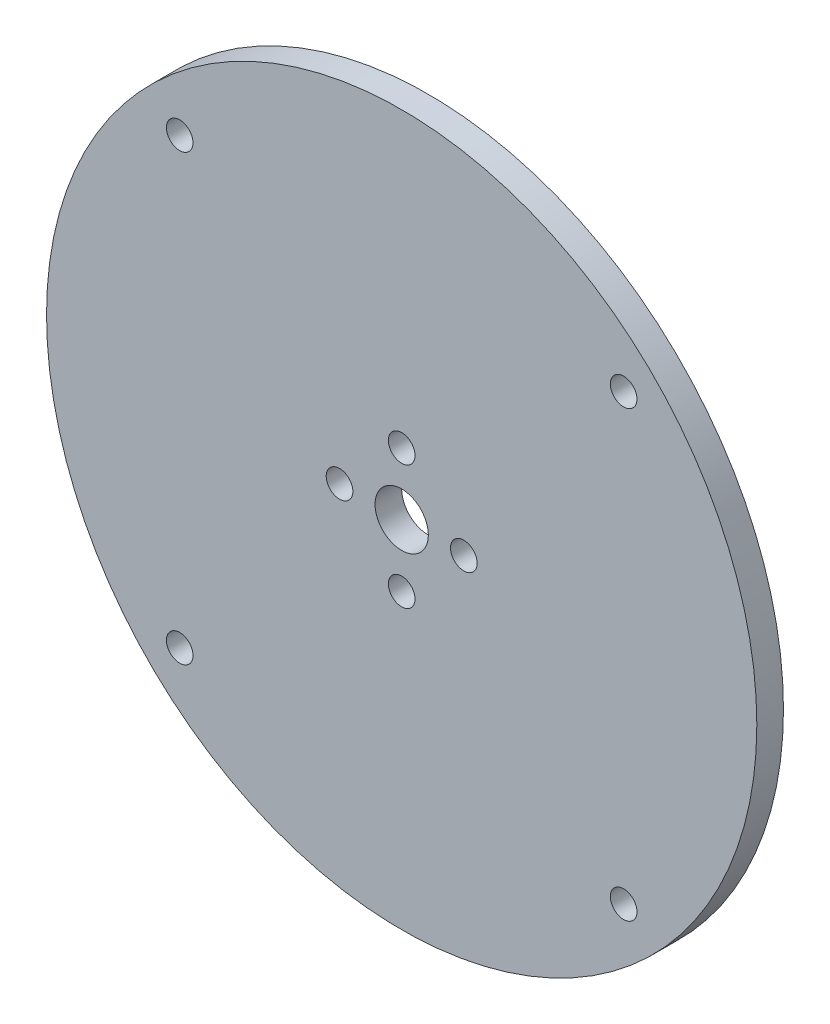
ISO-10303-21;
HEADER;
FILE_DESCRIPTION(('STEP AP214'),'2;1');
FILE_NAME('part.step','',(''),(''),'','','');
FILE_SCHEMA(('AUTOMOTIVE_DESIGN { 1 0 10303 214 1 1 1 1 }'));
ENDSEC;
DATA;
#1=APPLICATION_CONTEXT('core data for automotive mechanical design processes');
#2=APPLICATION_PROTOCOL_DEFINITION('international standard','automotive_design',2000,#1);
#3=PRODUCT_CONTEXT('',#1,'mechanical');
#4=PRODUCT('Part','Part','',(#3));
#5=PRODUCT_RELATED_PRODUCT_CATEGORY('part','',(#4));
#6=PRODUCT_DEFINITION_FORMATION('','',#4);
#7=PRODUCT_DEFINITION_CONTEXT('part definition',#1,'design');
#8=PRODUCT_DEFINITION('design','',#6,#7);
#9=PRODUCT_DEFINITION_SHAPE('','',#8);
#10=(LENGTH_UNIT() NAMED_UNIT(*) SI_UNIT(.MILLI.,.METRE.));
#11=(NAMED_UNIT(*) PLANE_ANGLE_UNIT() SI_UNIT($,.RADIAN.));
#12=(NAMED_UNIT(*) SI_UNIT($,.STERADIAN.) SOLID_ANGLE_UNIT());
#13=UNCERTAINTY_MEASURE_WITH_UNIT(LENGTH_MEASURE(1.E-05),#10,'distance_accuracy_value','');
#14=(GEOMETRIC_REPRESENTATION_CONTEXT(3) GLOBAL_UNCERTAINTY_ASSIGNED_CONTEXT((#13)) GLOBAL_UNIT_ASSIGNED_CONTEXT((#10,
#11,#12)) REPRESENTATION_CONTEXT('',''));
#15=CARTESIAN_POINT('',(0.,0.,0.));
#16=DIRECTION('',(0.,0.,1.));
#17=DIRECTION('',(1.,0.,0.));
#18=AXIS2_PLACEMENT_3D('',#15,#16,#17);
#19=CARTESIAN_POINT('',(7.,0.,3.));
#20=DIRECTION('',(0.,0.,-1.));
#21=DIRECTION('',(-1.,0.,0.));
#22=AXIS2_PLACEMENT_3D('',#19,#20,#21);
#23=CYLINDRICAL_SURFACE('',#22,1.5);
#24=CARTESIAN_POINT('',(7.,0.,3.));
#25=DIRECTION('',(0.,0.,1.));
#26=DIRECTION('',(1.,0.,0.));
#27=AXIS2_PLACEMENT_3D('',#24,#25,#26);
#28=CIRCLE('',#27,1.5);
#29=CARTESIAN_POINT('',(8.5,0.,3.));
#30=VERTEX_POINT('',#29);
#31=EDGE_CURVE('E50',#30,#30,#28,.T.);
#32=ORIENTED_EDGE('',*,*,#31,.T.);
#33=EDGE_LOOP('',(#32));
#34=FACE_BOUND('',#33,.T.);
#35=CARTESIAN_POINT('',(7.,0.,0.));
#36=DIRECTION('',(0.,0.,1.));
#37=DIRECTION('',(1.,0.,0.));
#38=AXIS2_PLACEMENT_3D('',#35,#36,#37);
#39=CIRCLE('',#38,1.5);
#40=CARTESIAN_POINT('',(8.5,0.,0.));
#41=VERTEX_POINT('',#40);
#42=EDGE_CURVE('E79',#41,#41,#39,.T.);
#43=ORIENTED_EDGE('',*,*,#42,.F.);
#44=EDGE_LOOP('',(#43));
#45=FACE_BOUND('',#44,.T.);
#46=ADVANCED_FACE('F39',(#34,#45),#23,.F.);
#47=CARTESIAN_POINT('',(0.,0.,3.));
#48=DIRECTION('',(0.,0.,-1.));
#49=DIRECTION('',(-1.,0.,0.));
#50=AXIS2_PLACEMENT_3D('',#47,#48,#49);
#51=CYLINDRICAL_SURFACE('',#50,40.);
#52=CARTESIAN_POINT('',(0.,0.,3.));
#53=DIRECTION('',(0.,0.,1.));
#54=DIRECTION('',(1.,0.,0.));
#55=AXIS2_PLACEMENT_3D('',#52,#53,#54);
#56=CIRCLE('',#55,40.);
#57=CARTESIAN_POINT('',(40.,0.,3.));
#58=VERTEX_POINT('',#57);
#59=EDGE_CURVE('E55',#58,#58,#56,.T.);
#60=ORIENTED_EDGE('',*,*,#59,.F.);
#61=EDGE_LOOP('',(#60));
#62=FACE_BOUND('',#61,.T.);
#63=CARTESIAN_POINT('',(0.,0.,0.));
#64=DIRECTION('',(0.,0.,1.));
#65=DIRECTION('',(1.,0.,0.));
#66=AXIS2_PLACEMENT_3D('',#63,#64,#65);
#67=CIRCLE('',#66,40.);
#68=CARTESIAN_POINT('',(40.,0.,0.));
#69=VERTEX_POINT('',#68);
#70=EDGE_CURVE('E80',#69,#69,#67,.T.);
#71=ORIENTED_EDGE('',*,*,#70,.T.);
#72=EDGE_LOOP('',(#71));
#73=FACE_BOUND('',#72,.T.);
#74=ADVANCED_FACE('F114',(#62,#73),#51,.T.);
#75=CARTESIAN_POINT('',(25.,-25.,3.));
#76=DIRECTION('',(0.,0.,-1.));
#77=DIRECTION('',(-1.,0.,0.));
#78=AXIS2_PLACEMENT_3D('',#75,#76,#77);
#79=CYLINDRICAL_SURFACE('',#78,1.5);
#80=CARTESIAN_POINT('',(25.,-25.,3.));
#81=DIRECTION('',(0.,0.,1.));
#82=DIRECTION('',(1.,0.,0.));
#83=AXIS2_PLACEMENT_3D('',#80,#81,#82);
#84=CIRCLE('',#83,1.5);
#85=CARTESIAN_POINT('',(26.5,-25.,3.));
#86=VERTEX_POINT('',#85);
#87=EDGE_CURVE('E110',#86,#86,#84,.T.);
#88=ORIENTED_EDGE('',*,*,#87,.T.);
#89=EDGE_LOOP('',(#88));
#90=FACE_BOUND('',#89,.T.);
#91=CARTESIAN_POINT('',(25.,-25.,0.));
#92=DIRECTION('',(0.,0.,1.));
#93=DIRECTION('',(1.,0.,0.));
#94=AXIS2_PLACEMENT_3D('',#91,#92,#93);
#95=CIRCLE('',#94,1.5);
#96=CARTESIAN_POINT('',(26.5,-25.,0.));
#97=VERTEX_POINT('',#96);
#98=EDGE_CURVE('E73',#97,#97,#95,.T.);
#99=ORIENTED_EDGE('',*,*,#98,.F.);
#100=EDGE_LOOP('',(#99));
#101=FACE_BOUND('',#100,.T.);
#102=ADVANCED_FACE('F117',(#90,#101),#79,.F.);
#103=CARTESIAN_POINT('',(-25.,-25.,3.));
#104=DIRECTION('',(0.,0.,-1.));
#105=DIRECTION('',(-1.,0.,0.));
#106=AXIS2_PLACEMENT_3D('',#103,#104,#105);
#107=CYLINDRICAL_SURFACE('',#106,1.5);
#108=CARTESIAN_POINT('',(-25.,-25.,3.));
#109=DIRECTION('',(0.,0.,1.));
#110=DIRECTION('',(1.,0.,0.));
#111=AXIS2_PLACEMENT_3D('',#108,#109,#110);
#112=CIRCLE('',#111,1.5);
#113=CARTESIAN_POINT('',(-23.5,-25.,3.));
#114=VERTEX_POINT('',#113);
#115=EDGE_CURVE('E104',#114,#114,#112,.T.);
#116=ORIENTED_EDGE('',*,*,#115,.T.);
#117=EDGE_LOOP('',(#116));
#118=FACE_BOUND('',#117,.T.);
#119=CARTESIAN_POINT('',(-25.,-25.,0.));
#120=DIRECTION('',(0.,0.,1.));
#121=DIRECTION('',(1.,0.,0.));
#122=AXIS2_PLACEMENT_3D('',#119,#120,#121);
#123=CIRCLE('',#122,1.5);
#124=CARTESIAN_POINT('',(-23.5,-25.,0.));
#125=VERTEX_POINT('',#124);
#126=EDGE_CURVE('E74',#125,#125,#123,.T.);
#127=ORIENTED_EDGE('',*,*,#126,.F.);
#128=EDGE_LOOP('',(#127));
#129=FACE_BOUND('',#128,.T.);
#130=ADVANCED_FACE('F141',(#118,#129),#107,.F.);
#131=CARTESIAN_POINT('',(25.,25.,3.));
#132=DIRECTION('',(0.,0.,-1.));
#133=DIRECTION('',(-1.,0.,0.));
#134=AXIS2_PLACEMENT_3D('',#131,#132,#133);
#135=CYLINDRICAL_SURFACE('',#134,1.5);
#136=CARTESIAN_POINT('',(25.,25.,3.));
#137=DIRECTION('',(0.,0.,1.));
#138=DIRECTION('',(1.,0.,0.));
#139=AXIS2_PLACEMENT_3D('',#136,#137,#138);
#140=CIRCLE('',#139,1.5);
#141=CARTESIAN_POINT('',(26.5,25.,3.));
#142=VERTEX_POINT('',#141);
#143=EDGE_CURVE('E103',#142,#142,#140,.T.);
#144=ORIENTED_EDGE('',*,*,#143,.T.);
#145=EDGE_LOOP('',(#144));
#146=FACE_BOUND('',#145,.T.);
#147=CARTESIAN_POINT('',(25.,25.,0.));
#148=DIRECTION('',(0.,0.,1.));
#149=DIRECTION('',(1.,0.,0.));
#150=AXIS2_PLACEMENT_3D('',#147,#148,#149);
#151=CIRCLE('',#150,1.5);
#152=CARTESIAN_POINT('',(26.5,25.,0.));
#153=VERTEX_POINT('',#152);
#154=EDGE_CURVE('E69',#153,#153,#151,.T.);
#155=ORIENTED_EDGE('',*,*,#154,.F.);
#156=EDGE_LOOP('',(#155));
#157=FACE_BOUND('',#156,.T.);
#158=ADVANCED_FACE('F150',(#146,#157),#135,.F.);
#159=CARTESIAN_POINT('',(-25.,25.,3.));
#160=DIRECTION('',(0.,0.,-1.));
#161=DIRECTION('',(-1.,0.,0.));
#162=AXIS2_PLACEMENT_3D('',#159,#160,#161);
#163=CYLINDRICAL_SURFACE('',#162,1.5);
#164=CARTESIAN_POINT('',(-25.,25.,3.));
#165=DIRECTION('',(0.,0.,1.));
#166=DIRECTION('',(1.,0.,0.));
#167=AXIS2_PLACEMENT_3D('',#164,#165,#166);
#168=CIRCLE('',#167,1.5);
#169=CARTESIAN_POINT('',(-23.5,25.,3.));
#170=VERTEX_POINT('',#169);
#171=EDGE_CURVE('E96',#170,#170,#168,.T.);
#172=ORIENTED_EDGE('',*,*,#171,.T.);
#173=EDGE_LOOP('',(#172));
#174=FACE_BOUND('',#173,.T.);
#175=CARTESIAN_POINT('',(-25.,25.,0.));
#176=DIRECTION('',(0.,0.,1.));
#177=DIRECTION('',(1.,0.,0.));
#178=AXIS2_PLACEMENT_3D('',#175,#176,#177);
#179=CIRCLE('',#178,1.5);
#180=CARTESIAN_POINT('',(-23.5,25.,0.));
#181=VERTEX_POINT('',#180);
#182=EDGE_CURVE('E64',#181,#181,#179,.T.);
#183=ORIENTED_EDGE('',*,*,#182,.F.);
#184=EDGE_LOOP('',(#183));
#185=FACE_BOUND('',#184,.T.);
#186=ADVANCED_FACE('F152',(#174,#185),#163,.F.);
#187=CARTESIAN_POINT('',(0.,7.,3.));
#188=DIRECTION('',(0.,0.,-1.));
#189=DIRECTION('',(-1.,0.,0.));
#190=AXIS2_PLACEMENT_3D('',#187,#188,#189);
#191=CYLINDRICAL_SURFACE('',#190,1.5);
#192=CARTESIAN_POINT('',(0.,7.,3.));
#193=DIRECTION('',(0.,0.,1.));
#194=DIRECTION('',(1.,0.,0.));
#195=AXIS2_PLACEMENT_3D('',#192,#193,#194);
#196=CIRCLE('',#195,1.5);
#197=CARTESIAN_POINT('',(1.5,7.,3.));
#198=VERTEX_POINT('',#197);
#199=EDGE_CURVE('E95',#198,#198,#196,.T.);
#200=ORIENTED_EDGE('',*,*,#199,.T.);
#201=EDGE_LOOP('',(#200));
#202=FACE_BOUND('',#201,.T.);
#203=CARTESIAN_POINT('',(0.,7.,0.));
#204=DIRECTION('',(0.,0.,1.));
#205=DIRECTION('',(1.,0.,0.));
#206=AXIS2_PLACEMENT_3D('',#203,#204,#205);
#207=CIRCLE('',#206,1.5);
#208=CARTESIAN_POINT('',(1.5,7.,0.));
#209=VERTEX_POINT('',#208);
#210=EDGE_CURVE('E65',#209,#209,#207,.T.);
#211=ORIENTED_EDGE('',*,*,#210,.F.);
#212=EDGE_LOOP('',(#211));
#213=FACE_BOUND('',#212,.T.);
#214=ADVANCED_FACE('F153',(#202,#213),#191,.F.);
#215=CARTESIAN_POINT('',(-7.,0.,3.));
#216=DIRECTION('',(0.,0.,-1.));
#217=DIRECTION('',(-1.,0.,0.));
#218=AXIS2_PLACEMENT_3D('',#215,#216,#217);
#219=CYLINDRICAL_SURFACE('',#218,1.5);
#220=CARTESIAN_POINT('',(-7.,0.,3.));
#221=DIRECTION('',(0.,0.,1.));
#222=DIRECTION('',(1.,0.,0.));
#223=AXIS2_PLACEMENT_3D('',#220,#221,#222);
#224=CIRCLE('',#223,1.5);
#225=CARTESIAN_POINT('',(-5.5,0.,3.));
#226=VERTEX_POINT('',#225);
#227=EDGE_CURVE('E89',#226,#226,#224,.T.);
#228=ORIENTED_EDGE('',*,*,#227,.T.);
#229=EDGE_LOOP('',(#228));
#230=FACE_BOUND('',#229,.T.);
#231=CARTESIAN_POINT('',(-7.,0.,0.));
#232=DIRECTION('',(0.,0.,1.));
#233=DIRECTION('',(1.,0.,0.));
#234=AXIS2_PLACEMENT_3D('',#231,#232,#233);
#235=CIRCLE('',#234,1.5);
#236=CARTESIAN_POINT('',(-5.5,0.,0.));
#237=VERTEX_POINT('',#236);
#238=EDGE_CURVE('E56',#237,#237,#235,.T.);
#239=ORIENTED_EDGE('',*,*,#238,.F.);
#240=EDGE_LOOP('',(#239));
#241=FACE_BOUND('',#240,.T.);
#242=ADVANCED_FACE('F160',(#230,#241),#219,.F.);
#243=CARTESIAN_POINT('',(0.,-7.,3.));
#244=DIRECTION('',(0.,0.,-1.));
#245=DIRECTION('',(-1.,0.,0.));
#246=AXIS2_PLACEMENT_3D('',#243,#244,#245);
#247=CYLINDRICAL_SURFACE('',#246,1.5);
#248=CARTESIAN_POINT('',(0.,-7.,3.));
#249=DIRECTION('',(0.,0.,1.));
#250=DIRECTION('',(1.,0.,0.));
#251=AXIS2_PLACEMENT_3D('',#248,#249,#250);
#252=CIRCLE('',#251,1.5);
#253=CARTESIAN_POINT('',(1.5,-7.,3.));
#254=VERTEX_POINT('',#253);
#255=EDGE_CURVE('E83',#254,#254,#252,.T.);
#256=ORIENTED_EDGE('',*,*,#255,.T.);
#257=EDGE_LOOP('',(#256));
#258=FACE_BOUND('',#257,.T.);
#259=CARTESIAN_POINT('',(0.,-7.,0.));
#260=DIRECTION('',(0.,0.,1.));
#261=DIRECTION('',(1.,0.,0.));
#262=AXIS2_PLACEMENT_3D('',#259,#260,#261);
#263=CIRCLE('',#262,1.5);
#264=CARTESIAN_POINT('',(1.5,-7.,0.));
#265=VERTEX_POINT('',#264);
#266=EDGE_CURVE('E57',#265,#265,#263,.T.);
#267=ORIENTED_EDGE('',*,*,#266,.F.);
#268=EDGE_LOOP('',(#267));
#269=FACE_BOUND('',#268,.T.);
#270=ADVANCED_FACE('F41',(#258,#269),#247,.F.);
#271=CARTESIAN_POINT('',(0.,0.,3.));
#272=DIRECTION('',(0.,0.,-1.));
#273=DIRECTION('',(-1.,0.,0.));
#274=AXIS2_PLACEMENT_3D('',#271,#272,#273);
#275=CYLINDRICAL_SURFACE('',#274,3.);
#276=CARTESIAN_POINT('',(0.,0.,3.));
#277=DIRECTION('',(0.,0.,1.));
#278=DIRECTION('',(1.,0.,0.));
#279=AXIS2_PLACEMENT_3D('',#276,#277,#278);
#280=CIRCLE('',#279,3.);
#281=CARTESIAN_POINT('',(3.,0.,3.));
#282=VERTEX_POINT('',#281);
#283=EDGE_CURVE('E10',#282,#282,#280,.T.);
#284=ORIENTED_EDGE('',*,*,#283,.T.);
#285=EDGE_LOOP('',(#284));
#286=FACE_BOUND('',#285,.T.);
#287=CARTESIAN_POINT('',(0.,0.,0.));
#288=DIRECTION('',(0.,0.,1.));
#289=DIRECTION('',(1.,0.,0.));
#290=AXIS2_PLACEMENT_3D('',#287,#288,#289);
#291=CIRCLE('',#290,3.);
#292=CARTESIAN_POINT('',(3.,0.,0.));
#293=VERTEX_POINT('',#292);
#294=EDGE_CURVE('E43',#293,#293,#291,.T.);
#295=ORIENTED_EDGE('',*,*,#294,.F.);
#296=EDGE_LOOP('',(#295));
#297=FACE_BOUND('',#296,.T.);
#298=ADVANCED_FACE('F128',(#286,#297),#275,.F.);
#299=CARTESIAN_POINT('',(0.,0.,3.));
#300=DIRECTION('',(0.,0.,1.));
#301=DIRECTION('',(1.,0.,0.));
#302=AXIS2_PLACEMENT_3D('',#299,#300,#301);
#303=PLANE('',#302);
#304=ORIENTED_EDGE('',*,*,#255,.F.);
#305=EDGE_LOOP('',(#304));
#306=FACE_BOUND('',#305,.T.);
#307=ORIENTED_EDGE('',*,*,#227,.F.);
#308=EDGE_LOOP('',(#307));
#309=FACE_BOUND('',#308,.T.);
#310=ORIENTED_EDGE('',*,*,#199,.F.);
#311=EDGE_LOOP('',(#310));
#312=FACE_BOUND('',#311,.T.);
#313=ORIENTED_EDGE('',*,*,#171,.F.);
#314=EDGE_LOOP('',(#313));
#315=FACE_BOUND('',#314,.T.);
#316=ORIENTED_EDGE('',*,*,#143,.F.);
#317=EDGE_LOOP('',(#316));
#318=FACE_BOUND('',#317,.T.);
#319=ORIENTED_EDGE('',*,*,#115,.F.);
#320=EDGE_LOOP('',(#319));
#321=FACE_BOUND('',#320,.T.);
#322=ORIENTED_EDGE('',*,*,#87,.F.);
#323=EDGE_LOOP('',(#322));
#324=FACE_BOUND('',#323,.T.);
#325=ORIENTED_EDGE('',*,*,#59,.T.);
#326=EDGE_LOOP('',(#325));
#327=FACE_BOUND('',#326,.T.);
#328=ORIENTED_EDGE('',*,*,#31,.F.);
#329=EDGE_LOOP('',(#328));
#330=FACE_BOUND('',#329,.T.);
#331=ORIENTED_EDGE('',*,*,#283,.F.);
#332=EDGE_LOOP('',(#331));
#333=FACE_BOUND('',#332,.T.);
#334=ADVANCED_FACE('F115',(#306,#309,#312,#315,#318,#321,#324,#327,#330,#333),#303,.T.);
#335=CARTESIAN_POINT('',(0.,0.,0.));
#336=DIRECTION('',(0.,0.,1.));
#337=DIRECTION('',(1.,0.,0.));
#338=AXIS2_PLACEMENT_3D('',#335,#336,#337);
#339=PLANE('',#338);
#340=ORIENTED_EDGE('',*,*,#266,.T.);
#341=EDGE_LOOP('',(#340));
#342=FACE_BOUND('',#341,.T.);
#343=ORIENTED_EDGE('',*,*,#238,.T.);
#344=EDGE_LOOP('',(#343));
#345=FACE_BOUND('',#344,.T.);
#346=ORIENTED_EDGE('',*,*,#210,.T.);
#347=EDGE_LOOP('',(#346));
#348=FACE_BOUND('',#347,.T.);
#349=ORIENTED_EDGE('',*,*,#182,.T.);
#350=EDGE_LOOP('',(#349));
#351=FACE_BOUND('',#350,.T.);
#352=ORIENTED_EDGE('',*,*,#154,.T.);
#353=EDGE_LOOP('',(#352));
#354=FACE_BOUND('',#353,.T.);
#355=ORIENTED_EDGE('',*,*,#126,.T.);
#356=EDGE_LOOP('',(#355));
#357=FACE_BOUND('',#356,.T.);
#358=ORIENTED_EDGE('',*,*,#98,.T.);
#359=EDGE_LOOP('',(#358));
#360=FACE_BOUND('',#359,.T.);
#361=ORIENTED_EDGE('',*,*,#70,.F.);
#362=EDGE_LOOP('',(#361));
#363=FACE_BOUND('',#362,.T.);
#364=ORIENTED_EDGE('',*,*,#42,.T.);
#365=EDGE_LOOP('',(#364));
#366=FACE_BOUND('',#365,.T.);
#367=ORIENTED_EDGE('',*,*,#294,.T.);
#368=EDGE_LOOP('',(#367));
#369=FACE_BOUND('',#368,.T.);
#370=ADVANCED_FACE('F125',(#342,#345,#348,#351,#354,#357,#360,#363,#366,#369),#339,.F.);
#371=CLOSED_SHELL('',(#46,#74,#102,#130,#158,#186,#214,#242,#270,#298,#334,#370));
#372=MANIFOLD_SOLID_BREP('B2',#371);
#373=ADVANCED_BREP_SHAPE_REPRESENTATION('',(#18,#372),#14);
#374=SHAPE_DEFINITION_REPRESENTATION(#9,#373);
ENDSEC;
END-ISO-10303-21;
